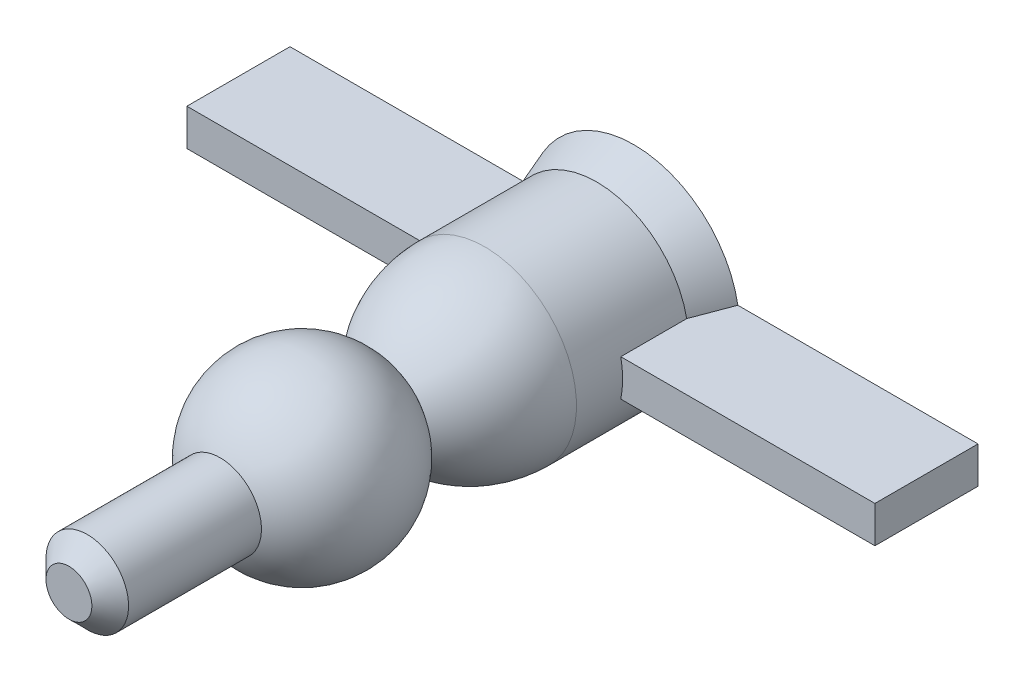
ISO-10303-21;
HEADER;
FILE_DESCRIPTION(('STEP AP214'),'2;1');
FILE_NAME('part.step','',(''),(''),'','','');
FILE_SCHEMA(('AUTOMOTIVE_DESIGN { 1 0 10303 214 1 1 1 1 }'));
ENDSEC;
DATA;
#1=APPLICATION_CONTEXT('core data for automotive mechanical design processes');
#2=APPLICATION_PROTOCOL_DEFINITION('international standard','automotive_design',2000,#1);
#3=PRODUCT_CONTEXT('',#1,'mechanical');
#4=PRODUCT('Part','Part','',(#3));
#5=PRODUCT_RELATED_PRODUCT_CATEGORY('part','',(#4));
#6=PRODUCT_DEFINITION_FORMATION('','',#4);
#7=PRODUCT_DEFINITION_CONTEXT('part definition',#1,'design');
#8=PRODUCT_DEFINITION('design','',#6,#7);
#9=PRODUCT_DEFINITION_SHAPE('','',#8);
#10=(LENGTH_UNIT() NAMED_UNIT(*) SI_UNIT(.MILLI.,.METRE.));
#11=(NAMED_UNIT(*) PLANE_ANGLE_UNIT() SI_UNIT($,.RADIAN.));
#12=(NAMED_UNIT(*) SI_UNIT($,.STERADIAN.) SOLID_ANGLE_UNIT());
#13=UNCERTAINTY_MEASURE_WITH_UNIT(LENGTH_MEASURE(1.E-05),#10,'distance_accuracy_value','');
#14=(GEOMETRIC_REPRESENTATION_CONTEXT(3) GLOBAL_UNCERTAINTY_ASSIGNED_CONTEXT((#13)) GLOBAL_UNIT_ASSIGNED_CONTEXT((#10,
#11,#12)) REPRESENTATION_CONTEXT('',''));
#15=CARTESIAN_POINT('',(0.,0.,0.));
#16=DIRECTION('',(0.,0.,1.));
#17=DIRECTION('',(1.,0.,0.));
#18=AXIS2_PLACEMENT_3D('',#15,#16,#17);
#19=CARTESIAN_POINT('',(0.,168.6,-66.0704679783864));
#20=DIRECTION('',(0.,0.,1.));
#21=DIRECTION('',(1.,0.,0.));
#22=AXIS2_PLACEMENT_3D('',#19,#20,#21);
#23=SPHERICAL_SURFACE('',#22,12.);
#24=CARTESIAN_POINT('',(0.,168.6,-55.3541253186916));
#25=DIRECTION('',(0.,0.,1.));
#26=DIRECTION('',(1.,0.,0.));
#27=AXIS2_PLACEMENT_3D('',#24,#25,#26);
#28=CIRCLE('',#27,5.4);
#29=CARTESIAN_POINT('',(-5.4,168.6,-55.3541253186916));
#30=VERTEX_POINT('',#29);
#31=EDGE_CURVE('E149',#30,#30,#28,.T.);
#32=ORIENTED_EDGE('',*,*,#31,.F.);
#33=CARTESIAN_POINT('',(0.,168.6,-66.0704679783864));
#34=DIRECTION('',(0.,-1.,0.));
#35=DIRECTION('',(-1.,0.,0.));
#36=AXIS2_PLACEMENT_3D('',#33,#34,#35);
#37=CIRCLE('',#36,12.);
#38=CARTESIAN_POINT('',(-5.39187816446128,168.6,-76.7908993997244));
#39=VERTEX_POINT('',#38);
#40=EDGE_CURVE('E11',#30,#39,#37,.T.);
#41=ORIENTED_EDGE('',*,*,#40,.T.);
#42=CARTESIAN_POINT('',(0.,168.6,-76.7908993997244));
#43=DIRECTION('',(0.,0.,1.));
#44=DIRECTION('',(1.,0.,0.));
#45=AXIS2_PLACEMENT_3D('',#42,#43,#44);
#46=CIRCLE('',#45,5.39187816446126);
#47=EDGE_CURVE('E259',#39,#39,#46,.T.);
#48=ORIENTED_EDGE('',*,*,#47,.T.);
#49=ORIENTED_EDGE('',*,*,#40,.F.);
#50=EDGE_LOOP('',(#32,#41,#48,#49));
#51=FACE_BOUND('',#50,.T.);
#52=ADVANCED_FACE('F17',(#51),#23,.T.);
#53=CARTESIAN_POINT('',(-12.,168.6,-89.9621148158838));
#54=CARTESIAN_POINT('',(-12.,156.6,-89.9621148158839));
#55=CARTESIAN_POINT('',(0.,156.6,-89.9621148158838));
#56=CARTESIAN_POINT('',(11.9999999999999,156.6,-89.9621148158839));
#57=CARTESIAN_POINT('',(12.,168.6,-89.9621148158838));
#58=CARTESIAN_POINT('',(11.9999999999999,180.6,-89.9621148158839));
#59=CARTESIAN_POINT('',(0.,180.6,-89.9621148158838));
#60=CARTESIAN_POINT('',(-12.,180.6,-89.9621148158839));
#61=CARTESIAN_POINT('',(-12.,168.6,-89.9621148158838));
#62=CARTESIAN_POINT('',(-11.9999999999999,168.6,-81.7188288748692));
#63=CARTESIAN_POINT('',(-11.9999999999999,156.6,-81.7188288748692));
#64=CARTESIAN_POINT('',(0.,156.6,-81.7188288748692));
#65=CARTESIAN_POINT('',(11.9999999999999,156.6,-81.7188288748692));
#66=CARTESIAN_POINT('',(11.9999999999999,168.6,-81.7188288748692));
#67=CARTESIAN_POINT('',(11.9999999999999,180.6,-81.7188288748692));
#68=CARTESIAN_POINT('',(0.,180.6,-81.7188288748692));
#69=CARTESIAN_POINT('',(-11.9999999999999,180.6,-81.7188288748692));
#70=CARTESIAN_POINT('',(-11.9999999999999,168.6,-81.7188288748692));
#71=CARTESIAN_POINT('',(-5.39187816446128,168.6,-76.7908993997244));
#72=CARTESIAN_POINT('',(-5.39187816446128,163.208121835539,-76.7908993997244));
#73=CARTESIAN_POINT('',(0.,163.208121835539,-76.7908993997244));
#74=CARTESIAN_POINT('',(5.39187816446125,163.208121835539,-76.7908993997244));
#75=CARTESIAN_POINT('',(5.39187816446125,168.6,-76.7908993997244));
#76=CARTESIAN_POINT('',(5.39187816446125,173.991878164461,-76.7908993997244));
#77=CARTESIAN_POINT('',(0.,173.991878164461,-76.7908993997244));
#78=CARTESIAN_POINT('',(-5.39187816446128,173.991878164461,-76.7908993997244));
#79=CARTESIAN_POINT('',(-5.39187816446128,168.6,-76.7908993997244));
#80=(BOUNDED_SURFACE() B_SPLINE_SURFACE(2,2,((#53,#54,#55,#56,#57,#58,#59,#60,#61),(#62,#63,#64,
#65,#66,#67,#68,#69,#70),(#71,#72,#73,#74,#75,#76,#77,#78,#79)),.UNSPECIFIED.,.F.,.T.,
.F.) B_SPLINE_SURFACE_WITH_KNOTS((3,3),(3,2,2,2,3),(0.,0.930028296705492),(-3.14159265358979,
-1.5707963267949,0.,1.5707963267949,3.14159265358979),
.UNSPECIFIED.) GEOMETRIC_REPRESENTATION_ITEM() RATIONAL_B_SPLINE_SURFACE(((1.,0.707106781186548,
1.,0.707106781186548,1.,0.707106781186548,1.,0.707106781186548,1.),(0.893815221073286,
0.632022803948673,0.893815221073286,0.632022803948673,0.893815221073286,0.632022803948673,
0.893815221073286,0.632022803948673,0.893815221073286),(1.,0.707106781186548,1.,
0.707106781186548,1.,0.707106781186548,1.,0.707106781186548,1.))) REPRESENTATION_ITEM('') SURFACE());
#81=CARTESIAN_POINT('',(4.4304014920225,168.6,-89.9621148158838));
#82=DIRECTION('',(0.,-1.,0.));
#83=DIRECTION('',(-1.,0.,0.));
#84=AXIS2_PLACEMENT_3D('',#81,#82,#83);
#85=CIRCLE('',#84,16.4304014920225);
#86=CARTESIAN_POINT('',(-11.9999999999999,168.6,-89.9621148158838));
#87=VERTEX_POINT('',#86);
#88=EDGE_CURVE('E25',#39,#87,#85,.T.);
#89=CARTESIAN_POINT('',(0.,168.6,-89.9621148158838));
#90=DIRECTION('',(0.,0.,1.));
#91=DIRECTION('',(1.,0.,0.));
#92=AXIS2_PLACEMENT_3D('',#89,#90,#91);
#93=CIRCLE('',#92,12.);
#94=EDGE_CURVE('E197',#87,#87,#93,.T.);
#95=ORIENTED_EDGE('',*,*,#47,.F.);
#96=ORIENTED_EDGE('',*,*,#88,.T.);
#97=ORIENTED_EDGE('',*,*,#94,.T.);
#98=ORIENTED_EDGE('',*,*,#88,.F.);
#99=EDGE_LOOP('',(#95,#96,#97,#98));
#100=FACE_BOUND('',#99,.T.);
#101=ADVANCED_FACE('F266',(#100),#80,.F.);
#102=CARTESIAN_POINT('',(0.,168.6,-107.055749478469));
#103=DIRECTION('',(0.,0.,-1.));
#104=DIRECTION('',(1.,0.,0.));
#105=AXIS2_PLACEMENT_3D('',#102,#103,#104);
#106=CONICAL_SURFACE('',#105,12.8998710467906,0.354798739797045);
#107=CARTESIAN_POINT('',(13.5894400859402,166.2,-109.484707050834));
#108=CARTESIAN_POINT('',(12.6096008272364,166.2,-106.880202745433));
#109=CARTESIAN_POINT('',(11.7575507653591,166.2,-104.626791906103));
#110=(BOUNDED_CURVE() B_SPLINE_CURVE(2,(#107,#108,#109),.UNSPECIFIED.,.F.,
.F.) B_SPLINE_CURVE_WITH_KNOTS((3,3),(0.,0.0865306026428558),
.UNSPECIFIED.) CURVE() GEOMETRIC_REPRESENTATION_ITEM() RATIONAL_B_SPLINE_CURVE((1.,
1.00253036805653,1.)) REPRESENTATION_ITEM(''));
#111=CARTESIAN_POINT('',(13.5894400859402,166.2,-109.484707050834));
#112=VERTEX_POINT('',#111);
#113=CARTESIAN_POINT('',(11.7575507653591,166.2,-104.626791906103));
#114=VERTEX_POINT('',#113);
#115=EDGE_CURVE('E298',#112,#114,#110,.T.);
#116=ORIENTED_EDGE('',*,*,#115,.T.);
#117=CARTESIAN_POINT('',(0.,168.6,-104.626791906103));
#118=DIRECTION('',(0.,0.,1.));
#119=DIRECTION('',(1.,0.,0.));
#120=AXIS2_PLACEMENT_3D('',#117,#118,#119);
#121=CIRCLE('',#120,11.9999999999999);
#122=CARTESIAN_POINT('',(-11.7575507653592,166.2,-104.626791906103));
#123=VERTEX_POINT('',#122);
#124=EDGE_CURVE('E249',#123,#114,#121,.T.);
#125=ORIENTED_EDGE('',*,*,#124,.F.);
#126=CARTESIAN_POINT('',(-11.7575507653592,166.2,-104.626791906103));
#127=CARTESIAN_POINT('',(-12.6096008272364,166.2,-106.880202745433));
#128=CARTESIAN_POINT('',(-13.5894400859402,166.2,-109.484707050834));
#129=(BOUNDED_CURVE() B_SPLINE_CURVE(2,(#126,#127,#128),.UNSPECIFIED.,.F.,
.F.) B_SPLINE_CURVE_WITH_KNOTS((3,3),(0.,0.0865306026428558),
.UNSPECIFIED.) CURVE() GEOMETRIC_REPRESENTATION_ITEM() RATIONAL_B_SPLINE_CURVE((1.,
1.00253036805653,1.)) REPRESENTATION_ITEM(''));
#130=CARTESIAN_POINT('',(-13.5894400859402,166.2,-109.484707050834));
#131=VERTEX_POINT('',#130);
#132=EDGE_CURVE('E229',#123,#131,#129,.T.);
#133=ORIENTED_EDGE('',*,*,#132,.T.);
#134=CARTESIAN_POINT('',(0.,168.6,-109.484707050834));
#135=DIRECTION('',(0.,0.,1.));
#136=DIRECTION('',(1.,0.,0.));
#137=AXIS2_PLACEMENT_3D('',#134,#135,#136);
#138=CIRCLE('',#137,13.7997420935812);
#139=EDGE_CURVE('E142',#131,#112,#138,.T.);
#140=ORIENTED_EDGE('',*,*,#139,.T.);
#141=EDGE_LOOP('',(#116,#125,#133,#140));
#142=FACE_BOUND('',#141,.T.);
#143=ADVANCED_FACE('F447',(#142),#106,.T.);
#144=CARTESIAN_POINT('',(13.7997420935812,168.6,-109.484707050834));
#145=DIRECTION('',(0.,0.,-1.));
#146=DIRECTION('',(0.,-1.,0.));
#147=AXIS2_PLACEMENT_3D('',#144,#145,#146);
#148=PLANE('',#147);
#149=ORIENTED_EDGE('',*,*,#139,.F.);
#150=DIRECTION('',(1.,0.,0.));
#151=VECTOR('',#150,1.);
#152=CARTESIAN_POINT('',(-1.87147959093686,166.2,-109.484707050834));
#153=LINE('',#152,#151);
#154=CARTESIAN_POINT('',(-45.0000006705523,166.2,-109.484707050834));
#155=VERTEX_POINT('',#154);
#156=EDGE_CURVE('E221',#155,#131,#153,.T.);
#157=ORIENTED_EDGE('',*,*,#156,.F.);
#158=DIRECTION('',(0.,1.,0.));
#159=VECTOR('',#158,1.);
#160=CARTESIAN_POINT('',(-45.0000006705523,168.6,-109.484707050834));
#161=LINE('',#160,#159);
#162=CARTESIAN_POINT('',(-45.0000006705523,171.,-109.484707050834));
#163=VERTEX_POINT('',#162);
#164=EDGE_CURVE('E205',#155,#163,#161,.T.);
#165=ORIENTED_EDGE('',*,*,#164,.T.);
#166=DIRECTION('',(-1.,0.,0.));
#167=VECTOR('',#166,1.);
#168=CARTESIAN_POINT('',(-1.87147959093686,171.,-109.484707050834));
#169=LINE('',#168,#167);
#170=CARTESIAN_POINT('',(-13.5894400859402,171.,-109.484707050834));
#171=VERTEX_POINT('',#170);
#172=EDGE_CURVE('E187',#171,#163,#169,.T.);
#173=ORIENTED_EDGE('',*,*,#172,.F.);
#174=CARTESIAN_POINT('',(0.,168.6,-109.484707050834));
#175=DIRECTION('',(0.,0.,1.));
#176=DIRECTION('',(1.,0.,0.));
#177=AXIS2_PLACEMENT_3D('',#174,#175,#176);
#178=CIRCLE('',#177,13.7997420935812);
#179=CARTESIAN_POINT('',(13.5894400859402,171.,-109.484707050834));
#180=VERTEX_POINT('',#179);
#181=EDGE_CURVE('E160',#180,#171,#178,.T.);
#182=ORIENTED_EDGE('',*,*,#181,.F.);
#183=DIRECTION('',(-1.,0.,0.));
#184=VECTOR('',#183,1.);
#185=CARTESIAN_POINT('',(1.87147959093686,171.,-109.484707050834));
#186=LINE('',#185,#184);
#187=CARTESIAN_POINT('',(45.0000006705523,171.,-109.484707050834));
#188=VERTEX_POINT('',#187);
#189=EDGE_CURVE('E174',#188,#180,#186,.T.);
#190=ORIENTED_EDGE('',*,*,#189,.F.);
#191=DIRECTION('',(0.,1.,0.));
#192=VECTOR('',#191,1.);
#193=CARTESIAN_POINT('',(45.0000006705523,168.6,-109.484707050834));
#194=LINE('',#193,#192);
#195=CARTESIAN_POINT('',(45.0000006705523,166.2,-109.484707050834));
#196=VERTEX_POINT('',#195);
#197=EDGE_CURVE('E161',#196,#188,#194,.T.);
#198=ORIENTED_EDGE('',*,*,#197,.F.);
#199=DIRECTION('',(1.,0.,0.));
#200=VECTOR('',#199,1.);
#201=CARTESIAN_POINT('',(1.87147959093686,166.2,-109.484707050834));
#202=LINE('',#201,#200);
#203=EDGE_CURVE('E292',#112,#196,#202,.T.);
#204=ORIENTED_EDGE('',*,*,#203,.F.);
#205=EDGE_LOOP('',(#149,#157,#165,#173,#182,#190,#198,#204));
#206=FACE_BOUND('',#205,.T.);
#207=ADVANCED_FACE('F336',(#206),#148,.T.);
#208=CARTESIAN_POINT('',(0.,168.6,-35.5705627484772));
#209=DIRECTION('',(0.,0.,1.));
#210=DIRECTION('',(1.,0.,0.));
#211=AXIS2_PLACEMENT_3D('',#208,#209,#210);
#212=PLANE('',#211);
#213=CARTESIAN_POINT('',(0.,168.6,-35.5705627484772));
#214=DIRECTION('',(0.,0.,1.));
#215=DIRECTION('',(1.,0.,0.));
#216=AXIS2_PLACEMENT_3D('',#213,#214,#215);
#217=CIRCLE('',#216,3.);
#218=CARTESIAN_POINT('',(-3.,168.6,-35.5705627484772));
#219=VERTEX_POINT('',#218);
#220=EDGE_CURVE('E138',#219,#219,#217,.T.);
#221=ORIENTED_EDGE('',*,*,#220,.T.);
#222=EDGE_LOOP('',(#221));
#223=FACE_BOUND('',#222,.T.);
#224=ADVANCED_FACE('F446',(#223),#212,.T.);
#225=CARTESIAN_POINT('',(0.,168.6,-36.7705627484772));
#226=DIRECTION('',(0.,0.,-1.));
#227=DIRECTION('',(1.,0.,0.));
#228=AXIS2_PLACEMENT_3D('',#225,#226,#227);
#229=CONICAL_SURFACE('',#228,4.2,0.785398163397448);
#230=ORIENTED_EDGE('',*,*,#220,.F.);
#231=DIRECTION('',(-0.707106781186547,0.,-0.707106781186548));
#232=VECTOR('',#231,1.);
#233=CARTESIAN_POINT('',(-4.2,168.6,-36.7705627484772));
#234=LINE('',#233,#232);
#235=CARTESIAN_POINT('',(-5.4,168.6,-37.9705627484772));
#236=VERTEX_POINT('',#235);
#237=EDGE_CURVE('E48',#219,#236,#234,.T.);
#238=ORIENTED_EDGE('',*,*,#237,.T.);
#239=CARTESIAN_POINT('',(0.,168.6,-37.9705627484772));
#240=DIRECTION('',(0.,0.,1.));
#241=DIRECTION('',(1.,0.,0.));
#242=AXIS2_PLACEMENT_3D('',#239,#240,#241);
#243=CIRCLE('',#242,5.4);
#244=EDGE_CURVE('E136',#236,#236,#243,.T.);
#245=ORIENTED_EDGE('',*,*,#244,.T.);
#246=ORIENTED_EDGE('',*,*,#237,.F.);
#247=EDGE_LOOP('',(#230,#238,#245,#246));
#248=FACE_BOUND('',#247,.T.);
#249=ADVANCED_FACE('F140',(#248),#229,.T.);
#250=CARTESIAN_POINT('',(0.,168.6,-46.6623440335843));
#251=DIRECTION('',(0.,0.,1.));
#252=DIRECTION('',(1.,0.,0.));
#253=AXIS2_PLACEMENT_3D('',#250,#251,#252);
#254=CYLINDRICAL_SURFACE('',#253,5.4);
#255=ORIENTED_EDGE('',*,*,#244,.F.);
#256=DIRECTION('',(0.,0.,-1.));
#257=VECTOR('',#256,1.);
#258=CARTESIAN_POINT('',(-5.4,168.6,-46.6623440335843));
#259=LINE('',#258,#257);
#260=EDGE_CURVE('E150',#236,#30,#259,.T.);
#261=ORIENTED_EDGE('',*,*,#260,.T.);
#262=ORIENTED_EDGE('',*,*,#31,.T.);
#263=ORIENTED_EDGE('',*,*,#260,.F.);
#264=EDGE_LOOP('',(#255,#261,#262,#263));
#265=FACE_BOUND('',#264,.T.);
#266=ADVANCED_FACE('F146',(#265),#254,.T.);
#267=CARTESIAN_POINT('',(0.,168.6,-107.055749478469));
#268=DIRECTION('',(0.,0.,-1.));
#269=DIRECTION('',(1.,0.,0.));
#270=AXIS2_PLACEMENT_3D('',#267,#268,#269);
#271=CONICAL_SURFACE('',#270,12.8998710467906,0.354798739797045);
#272=CARTESIAN_POINT('',(11.7575507653591,171.,-104.626791906103));
#273=CARTESIAN_POINT('',(12.6096008272364,171.,-106.880202745433));
#274=CARTESIAN_POINT('',(13.5894400859402,171.,-109.484707050834));
#275=(BOUNDED_CURVE() B_SPLINE_CURVE(2,(#272,#273,#274),.UNSPECIFIED.,.F.,
.F.) B_SPLINE_CURVE_WITH_KNOTS((3,3),(0.,0.0865306026428558),
.UNSPECIFIED.) CURVE() GEOMETRIC_REPRESENTATION_ITEM() RATIONAL_B_SPLINE_CURVE((1.,
1.00253036805653,1.)) REPRESENTATION_ITEM(''));
#276=CARTESIAN_POINT('',(11.7575507653591,171.,-104.626791906103));
#277=VERTEX_POINT('',#276);
#278=EDGE_CURVE('E180',#277,#180,#275,.T.);
#279=ORIENTED_EDGE('',*,*,#278,.T.);
#280=ORIENTED_EDGE('',*,*,#181,.T.);
#281=CARTESIAN_POINT('',(-13.5894400859402,171.,-109.484707050834));
#282=CARTESIAN_POINT('',(-12.6096008272364,171.,-106.880202745433));
#283=CARTESIAN_POINT('',(-11.7575507653592,171.,-104.626791906103));
#284=(BOUNDED_CURVE() B_SPLINE_CURVE(2,(#281,#282,#283),.UNSPECIFIED.,.F.,
.F.) B_SPLINE_CURVE_WITH_KNOTS((3,3),(0.,0.0865306026428558),
.UNSPECIFIED.) CURVE() GEOMETRIC_REPRESENTATION_ITEM() RATIONAL_B_SPLINE_CURVE((1.,
1.00253036805653,1.)) REPRESENTATION_ITEM(''));
#285=CARTESIAN_POINT('',(-11.7575507653592,171.,-104.626791906103));
#286=VERTEX_POINT('',#285);
#287=EDGE_CURVE('E198',#171,#286,#284,.T.);
#288=ORIENTED_EDGE('',*,*,#287,.T.);
#289=CARTESIAN_POINT('',(0.,168.6,-104.626791906103));
#290=DIRECTION('',(0.,0.,1.));
#291=DIRECTION('',(1.,0.,0.));
#292=AXIS2_PLACEMENT_3D('',#289,#290,#291);
#293=CIRCLE('',#292,11.9999999999999);
#294=EDGE_CURVE('E252',#277,#286,#293,.T.);
#295=ORIENTED_EDGE('',*,*,#294,.F.);
#296=EDGE_LOOP('',(#279,#280,#288,#295));
#297=FACE_BOUND('',#296,.T.);
#298=ADVANCED_FACE('F489',(#297),#271,.T.);
#299=CARTESIAN_POINT('',(0.,168.6,-97.2944533609938));
#300=DIRECTION('',(0.,0.,1.));
#301=DIRECTION('',(1.,0.,0.));
#302=AXIS2_PLACEMENT_3D('',#299,#300,#301);
#303=CYLINDRICAL_SURFACE('',#302,11.9999999999999);
#304=ORIENTED_EDGE('',*,*,#94,.F.);
#305=DIRECTION('',(0.,0.,-1.));
#306=VECTOR('',#305,1.);
#307=CARTESIAN_POINT('',(-11.9999999999999,168.6,-97.2944533609938));
#308=LINE('',#307,#306);
#309=CARTESIAN_POINT('',(-11.9999999999999,168.6,-96.0000014305116));
#310=VERTEX_POINT('',#309);
#311=EDGE_CURVE('E203',#87,#310,#308,.T.);
#312=ORIENTED_EDGE('',*,*,#311,.T.);
#313=CARTESIAN_POINT('',(0.,168.6,-96.0000014305116));
#314=DIRECTION('',(0.,0.,1.));
#315=DIRECTION('',(1.,0.,0.));
#316=AXIS2_PLACEMENT_3D('',#313,#314,#315);
#317=CIRCLE('',#316,11.9999999999999);
#318=CARTESIAN_POINT('',(-11.7575507653591,166.2,-96.0000014305116));
#319=VERTEX_POINT('',#318);
#320=EDGE_CURVE('E241',#310,#319,#317,.T.);
#321=ORIENTED_EDGE('',*,*,#320,.T.);
#322=DIRECTION('',(0.,0.,-1.));
#323=VECTOR('',#322,1.);
#324=CARTESIAN_POINT('',(-11.7575507653591,166.2,-97.2944533609938));
#325=LINE('',#324,#323);
#326=EDGE_CURVE('E220',#319,#123,#325,.T.);
#327=ORIENTED_EDGE('',*,*,#326,.T.);
#328=ORIENTED_EDGE('',*,*,#124,.T.);
#329=DIRECTION('',(0.,0.,1.));
#330=VECTOR('',#329,1.);
#331=CARTESIAN_POINT('',(11.7575507653591,166.2,-97.2944533609938));
#332=LINE('',#331,#330);
#333=CARTESIAN_POINT('',(11.7575507653591,166.2,-96.0000014305116));
#334=VERTEX_POINT('',#333);
#335=EDGE_CURVE('E327',#114,#334,#332,.T.);
#336=ORIENTED_EDGE('',*,*,#335,.T.);
#337=CARTESIAN_POINT('',(0.,168.6,-96.0000014305116));
#338=DIRECTION('',(0.,0.,1.));
#339=DIRECTION('',(1.,0.,0.));
#340=AXIS2_PLACEMENT_3D('',#337,#338,#339);
#341=CIRCLE('',#340,11.9999999999999);
#342=CARTESIAN_POINT('',(11.7575507653591,171.,-96.0000014305116));
#343=VERTEX_POINT('',#342);
#344=EDGE_CURVE('E169',#334,#343,#341,.T.);
#345=ORIENTED_EDGE('',*,*,#344,.T.);
#346=DIRECTION('',(0.,0.,-1.));
#347=VECTOR('',#346,1.);
#348=CARTESIAN_POINT('',(11.7575507653591,171.,-97.2944533609938));
#349=LINE('',#348,#347);
#350=EDGE_CURVE('E177',#343,#277,#349,.T.);
#351=ORIENTED_EDGE('',*,*,#350,.T.);
#352=ORIENTED_EDGE('',*,*,#294,.T.);
#353=DIRECTION('',(0.,0.,1.));
#354=VECTOR('',#353,1.);
#355=CARTESIAN_POINT('',(-11.7575507653591,171.,-97.2944533609938));
#356=LINE('',#355,#354);
#357=CARTESIAN_POINT('',(-11.7575507653591,171.,-96.0000014305116));
#358=VERTEX_POINT('',#357);
#359=EDGE_CURVE('E190',#286,#358,#356,.T.);
#360=ORIENTED_EDGE('',*,*,#359,.T.);
#361=CARTESIAN_POINT('',(0.,168.6,-96.0000014305116));
#362=DIRECTION('',(0.,0.,1.));
#363=DIRECTION('',(1.,0.,0.));
#364=AXIS2_PLACEMENT_3D('',#361,#362,#363);
#365=CIRCLE('',#364,11.9999999999999);
#366=EDGE_CURVE('E233',#358,#310,#365,.T.);
#367=ORIENTED_EDGE('',*,*,#366,.T.);
#368=ORIENTED_EDGE('',*,*,#311,.F.);
#369=EDGE_LOOP('',(#304,#312,#321,#327,#328,#336,#345,#351,#352,#360,#367,#368));
#370=FACE_BOUND('',#369,.T.);
#371=ADVANCED_FACE('F269',(#370),#303,.T.);
#372=CARTESIAN_POINT('',(-45.0000006705523,168.6,-109.484707050834));
#373=DIRECTION('',(-1.,0.,0.));
#374=DIRECTION('',(0.,0.,1.));
#375=AXIS2_PLACEMENT_3D('',#372,#373,#374);
#376=PLANE('',#375);
#377=DIRECTION('',(0.,1.,0.));
#378=VECTOR('',#377,1.);
#379=CARTESIAN_POINT('',(-45.0000006705523,168.6,-96.0000014305116));
#380=LINE('',#379,#378);
#381=CARTESIAN_POINT('',(-45.0000006705523,166.2,-96.0000014305116));
#382=VERTEX_POINT('',#381);
#383=CARTESIAN_POINT('',(-45.0000006705523,171.,-96.0000014305116));
#384=VERTEX_POINT('',#383);
#385=EDGE_CURVE('E234',#382,#384,#380,.T.);
#386=ORIENTED_EDGE('',*,*,#385,.T.);
#387=DIRECTION('',(0.,0.,1.));
#388=VECTOR('',#387,1.);
#389=CARTESIAN_POINT('',(-45.0000006705523,171.,-109.484707050834));
#390=LINE('',#389,#388);
#391=EDGE_CURVE('E193',#163,#384,#390,.T.);
#392=ORIENTED_EDGE('',*,*,#391,.F.);
#393=ORIENTED_EDGE('',*,*,#164,.F.);
#394=DIRECTION('',(0.,0.,-1.));
#395=VECTOR('',#394,1.);
#396=CARTESIAN_POINT('',(-45.0000006705523,166.2,-109.484707050834));
#397=LINE('',#396,#395);
#398=EDGE_CURVE('E224',#382,#155,#397,.T.);
#399=ORIENTED_EDGE('',*,*,#398,.F.);
#400=EDGE_LOOP('',(#386,#392,#393,#399));
#401=FACE_BOUND('',#400,.T.);
#402=ADVANCED_FACE('F456',(#401),#376,.T.);
#403=CARTESIAN_POINT('',(-45.0000006705523,168.6,-96.0000014305116));
#404=DIRECTION('',(0.,0.,1.));
#405=DIRECTION('',(1.,0.,0.));
#406=AXIS2_PLACEMENT_3D('',#403,#404,#405);
#407=PLANE('',#406);
#408=ORIENTED_EDGE('',*,*,#366,.F.);
#409=DIRECTION('',(1.,0.,0.));
#410=VECTOR('',#409,1.);
#411=CARTESIAN_POINT('',(-45.0000006705523,171.,-96.0000014305116));
#412=LINE('',#411,#410);
#413=EDGE_CURVE('E212',#384,#358,#412,.T.);
#414=ORIENTED_EDGE('',*,*,#413,.F.);
#415=ORIENTED_EDGE('',*,*,#385,.F.);
#416=DIRECTION('',(-1.,0.,0.));
#417=VECTOR('',#416,1.);
#418=CARTESIAN_POINT('',(-45.0000006705523,166.2,-96.0000014305116));
#419=LINE('',#418,#417);
#420=EDGE_CURVE('E218',#319,#382,#419,.T.);
#421=ORIENTED_EDGE('',*,*,#420,.F.);
#422=ORIENTED_EDGE('',*,*,#320,.F.);
#423=EDGE_LOOP('',(#408,#414,#415,#421,#422));
#424=FACE_BOUND('',#423,.T.);
#425=ADVANCED_FACE('F277',(#424),#407,.T.);
#426=CARTESIAN_POINT('',(0.,166.2,-102.742354240673));
#427=DIRECTION('',(0.,-1.,0.));
#428=DIRECTION('',(0.,0.,-1.));
#429=AXIS2_PLACEMENT_3D('',#426,#427,#428);
#430=PLANE('',#429);
#431=ORIENTED_EDGE('',*,*,#326,.F.);
#432=ORIENTED_EDGE('',*,*,#420,.T.);
#433=ORIENTED_EDGE('',*,*,#398,.T.);
#434=ORIENTED_EDGE('',*,*,#156,.T.);
#435=ORIENTED_EDGE('',*,*,#132,.F.);
#436=EDGE_LOOP('',(#431,#432,#433,#434,#435));
#437=FACE_BOUND('',#436,.T.);
#438=ADVANCED_FACE('F284',(#437),#430,.T.);
#439=CARTESIAN_POINT('',(0.,171.,-102.742354240673));
#440=DIRECTION('',(0.,1.,0.));
#441=DIRECTION('',(1.,0.,0.));
#442=AXIS2_PLACEMENT_3D('',#439,#440,#441);
#443=PLANE('',#442);
#444=ORIENTED_EDGE('',*,*,#359,.F.);
#445=ORIENTED_EDGE('',*,*,#287,.F.);
#446=ORIENTED_EDGE('',*,*,#172,.T.);
#447=ORIENTED_EDGE('',*,*,#391,.T.);
#448=ORIENTED_EDGE('',*,*,#413,.T.);
#449=EDGE_LOOP('',(#444,#445,#446,#447,#448));
#450=FACE_BOUND('',#449,.T.);
#451=ADVANCED_FACE('F481',(#450),#443,.T.);
#452=CARTESIAN_POINT('',(0.,171.,-102.742354240673));
#453=DIRECTION('',(0.,1.,0.));
#454=DIRECTION('',(1.,0.,0.));
#455=AXIS2_PLACEMENT_3D('',#452,#453,#454);
#456=PLANE('',#455);
#457=ORIENTED_EDGE('',*,*,#350,.F.);
#458=DIRECTION('',(1.,0.,0.));
#459=VECTOR('',#458,1.);
#460=CARTESIAN_POINT('',(45.0000006705523,171.,-96.0000014305116));
#461=LINE('',#460,#459);
#462=CARTESIAN_POINT('',(45.0000006705523,171.,-96.0000014305116));
#463=VERTEX_POINT('',#462);
#464=EDGE_CURVE('E172',#343,#463,#461,.T.);
#465=ORIENTED_EDGE('',*,*,#464,.T.);
#466=DIRECTION('',(0.,0.,-1.));
#467=VECTOR('',#466,1.);
#468=CARTESIAN_POINT('',(45.0000006705523,171.,-109.484707050834));
#469=LINE('',#468,#467);
#470=EDGE_CURVE('E162',#463,#188,#469,.T.);
#471=ORIENTED_EDGE('',*,*,#470,.T.);
#472=ORIENTED_EDGE('',*,*,#189,.T.);
#473=ORIENTED_EDGE('',*,*,#278,.F.);
#474=EDGE_LOOP('',(#457,#465,#471,#472,#473));
#475=FACE_BOUND('',#474,.T.);
#476=ADVANCED_FACE('F322',(#475),#456,.T.);
#477=CARTESIAN_POINT('',(1.87147959093686,168.6,-96.0000014305116));
#478=DIRECTION('',(0.,0.,1.));
#479=DIRECTION('',(1.,0.,0.));
#480=AXIS2_PLACEMENT_3D('',#477,#478,#479);
#481=PLANE('',#480);
#482=ORIENTED_EDGE('',*,*,#344,.F.);
#483=DIRECTION('',(-1.,0.,0.));
#484=VECTOR('',#483,1.);
#485=CARTESIAN_POINT('',(45.0000006705523,166.2,-96.0000014305116));
#486=LINE('',#485,#484);
#487=CARTESIAN_POINT('',(45.0000006705523,166.2,-96.0000014305116));
#488=VERTEX_POINT('',#487);
#489=EDGE_CURVE('E304',#488,#334,#486,.T.);
#490=ORIENTED_EDGE('',*,*,#489,.F.);
#491=DIRECTION('',(0.,1.,0.));
#492=VECTOR('',#491,1.);
#493=CARTESIAN_POINT('',(45.0000006705523,168.6,-96.0000014305116));
#494=LINE('',#493,#492);
#495=EDGE_CURVE('E170',#488,#463,#494,.T.);
#496=ORIENTED_EDGE('',*,*,#495,.T.);
#497=ORIENTED_EDGE('',*,*,#464,.F.);
#498=EDGE_LOOP('',(#482,#490,#496,#497));
#499=FACE_BOUND('',#498,.T.);
#500=ADVANCED_FACE('F318',(#499),#481,.T.);
#501=CARTESIAN_POINT('',(45.0000006705523,168.6,-96.0000014305116));
#502=DIRECTION('',(1.,0.,0.));
#503=DIRECTION('',(0.,1.,0.));
#504=AXIS2_PLACEMENT_3D('',#501,#502,#503);
#505=PLANE('',#504);
#506=ORIENTED_EDGE('',*,*,#197,.T.);
#507=ORIENTED_EDGE('',*,*,#470,.F.);
#508=ORIENTED_EDGE('',*,*,#495,.F.);
#509=DIRECTION('',(0.,0.,1.));
#510=VECTOR('',#509,1.);
#511=CARTESIAN_POINT('',(45.0000006705523,166.2,-109.484707050834));
#512=LINE('',#511,#510);
#513=EDGE_CURVE('E297',#196,#488,#512,.T.);
#514=ORIENTED_EDGE('',*,*,#513,.F.);
#515=EDGE_LOOP('',(#506,#507,#508,#514));
#516=FACE_BOUND('',#515,.T.);
#517=ADVANCED_FACE('F325',(#516),#505,.T.);
#518=CARTESIAN_POINT('',(0.,166.2,-102.742354240673));
#519=DIRECTION('',(0.,-1.,0.));
#520=DIRECTION('',(0.,0.,-1.));
#521=AXIS2_PLACEMENT_3D('',#518,#519,#520);
#522=PLANE('',#521);
#523=ORIENTED_EDGE('',*,*,#335,.F.);
#524=ORIENTED_EDGE('',*,*,#115,.F.);
#525=ORIENTED_EDGE('',*,*,#203,.T.);
#526=ORIENTED_EDGE('',*,*,#513,.T.);
#527=ORIENTED_EDGE('',*,*,#489,.T.);
#528=EDGE_LOOP('',(#523,#524,#525,#526,#527));
#529=FACE_BOUND('',#528,.T.);
#530=ADVANCED_FACE('F332',(#529),#522,.T.);
#531=CLOSED_SHELL('',(#52,#101,#143,#207,#224,#249,#266,#298,#371,#402,#425,#438,#451,#476,#500,
#517,#530));
#532=MANIFOLD_SOLID_BREP('B1',#531);
#533=ADVANCED_BREP_SHAPE_REPRESENTATION('',(#18,#532),#14);
#534=SHAPE_DEFINITION_REPRESENTATION(#9,#533);
ENDSEC;
END-ISO-10303-21;
